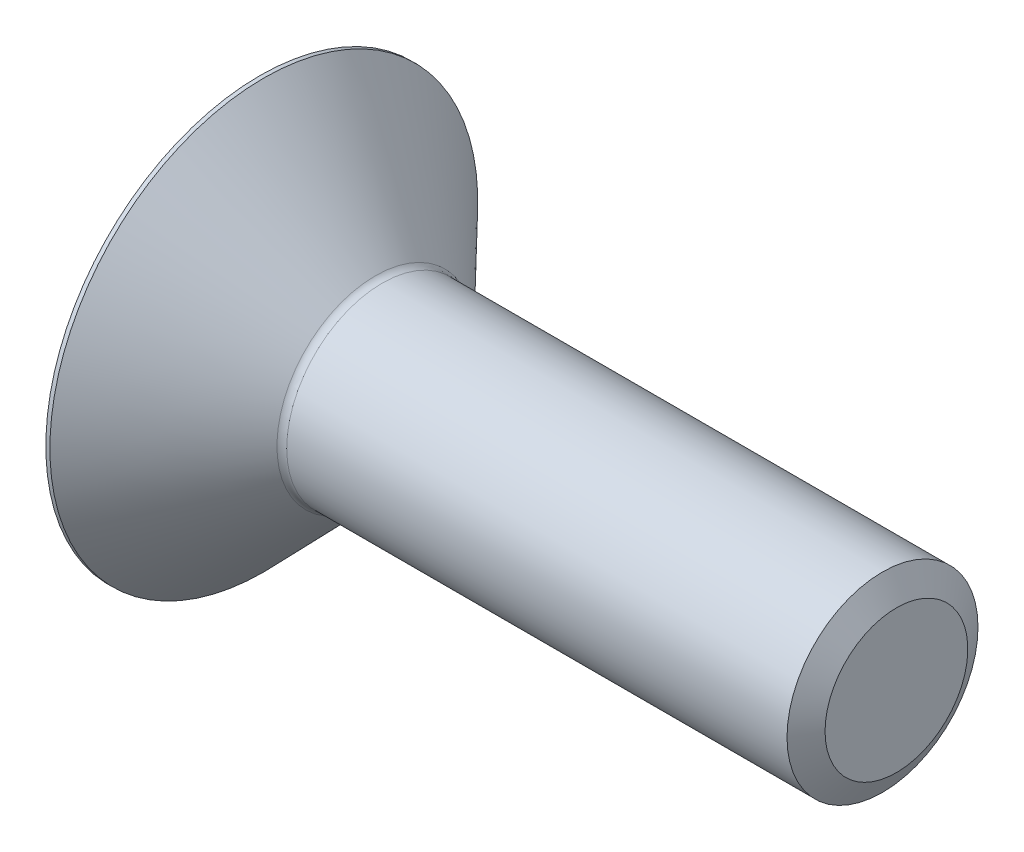
ISO-10303-21;
HEADER;
FILE_DESCRIPTION(('STEP AP214'),'2;1');
FILE_NAME('part.step','',(''),(''),'','','');
FILE_SCHEMA(('AUTOMOTIVE_DESIGN { 1 0 10303 214 1 1 1 1 }'));
ENDSEC;
DATA;
#1=APPLICATION_CONTEXT('core data for automotive mechanical design processes');
#2=APPLICATION_PROTOCOL_DEFINITION('international standard','automotive_design',2000,#1);
#3=PRODUCT_CONTEXT('',#1,'mechanical');
#4=PRODUCT('Part','Part','',(#3));
#5=PRODUCT_RELATED_PRODUCT_CATEGORY('part','',(#4));
#6=PRODUCT_DEFINITION_FORMATION('','',#4);
#7=PRODUCT_DEFINITION_CONTEXT('part definition',#1,'design');
#8=PRODUCT_DEFINITION('design','',#6,#7);
#9=PRODUCT_DEFINITION_SHAPE('','',#8);
#10=(LENGTH_UNIT() NAMED_UNIT(*) SI_UNIT(.MILLI.,.METRE.));
#11=(NAMED_UNIT(*) PLANE_ANGLE_UNIT() SI_UNIT($,.RADIAN.));
#12=(NAMED_UNIT(*) SI_UNIT($,.STERADIAN.) SOLID_ANGLE_UNIT());
#13=UNCERTAINTY_MEASURE_WITH_UNIT(LENGTH_MEASURE(1.E-05),#10,'distance_accuracy_value','');
#14=(GEOMETRIC_REPRESENTATION_CONTEXT(3) GLOBAL_UNCERTAINTY_ASSIGNED_CONTEXT((#13)) GLOBAL_UNIT_ASSIGNED_CONTEXT((#10,
#11,#12)) REPRESENTATION_CONTEXT('',''));
#15=CARTESIAN_POINT('',(0.,0.,0.));
#16=DIRECTION('',(0.,0.,1.));
#17=DIRECTION('',(1.,0.,0.));
#18=AXIS2_PLACEMENT_3D('',#15,#16,#17);
#19=CARTESIAN_POINT('',(0.,0.,0.));
#20=DIRECTION('',(1.,0.,0.));
#21=DIRECTION('',(0.,1.,0.));
#22=AXIS2_PLACEMENT_3D('',#19,#20,#21);
#23=CYLINDRICAL_SURFACE('',#22,6.);
#24=CARTESIAN_POINT('',(-32.3053151102742,0.,0.));
#25=DIRECTION('',(1.,0.,0.));
#26=DIRECTION('',(0.,1.,0.));
#27=AXIS2_PLACEMENT_3D('',#24,#25,#26);
#28=CIRCLE('',#27,6.);
#29=CARTESIAN_POINT('',(-32.3053151102742,5.99999999999999,0.));
#30=VERTEX_POINT('',#29);
#31=EDGE_CURVE('E127',#30,#30,#28,.T.);
#32=ORIENTED_EDGE('',*,*,#31,.T.);
#33=EDGE_LOOP('',(#32));
#34=FACE_BOUND('',#33,.T.);
#35=CARTESIAN_POINT('',(-0.874999999999999,0.,0.));
#36=DIRECTION('',(-1.,0.,0.));
#37=DIRECTION('',(0.,0.,1.));
#38=AXIS2_PLACEMENT_3D('',#35,#36,#37);
#39=CIRCLE('',#38,6.);
#40=CARTESIAN_POINT('',(-0.874999999999999,0.,6.));
#41=VERTEX_POINT('',#40);
#42=EDGE_CURVE('E314',#41,#41,#39,.T.);
#43=ORIENTED_EDGE('',*,*,#42,.T.);
#44=EDGE_LOOP('',(#43));
#45=FACE_BOUND('',#44,.T.);
#46=ADVANCED_FACE('F40',(#34,#45),#23,.T.);
#47=CARTESIAN_POINT('',(-40.,13.44,0.));
#48=DIRECTION('',(-1.,0.,0.));
#49=DIRECTION('',(0.,-1.,0.));
#50=AXIS2_PLACEMENT_3D('',#47,#48,#49);
#51=PLANE('',#50);
#52=CARTESIAN_POINT('',(-40.,0.,0.));
#53=DIRECTION('',(1.,0.,0.));
#54=DIRECTION('',(0.,1.,0.));
#55=AXIS2_PLACEMENT_3D('',#52,#53,#54);
#56=CIRCLE('',#55,13.44);
#57=CARTESIAN_POINT('',(-40.,13.44,0.));
#58=VERTEX_POINT('',#57);
#59=EDGE_CURVE('E216',#58,#58,#56,.T.);
#60=ORIENTED_EDGE('',*,*,#59,.F.);
#61=EDGE_LOOP('',(#60));
#62=FACE_BOUND('',#61,.T.);
#63=CARTESIAN_POINT('',(-40.,0.,0.));
#64=DIRECTION('',(-1.,0.,0.));
#65=DIRECTION('',(0.,-1.,0.));
#66=AXIS2_PLACEMENT_3D('',#63,#64,#65);
#67=CIRCLE('',#66,4.61880215351699);
#68=CARTESIAN_POINT('',(-40.,-2.30940107675853,3.99999999999998));
#69=VERTEX_POINT('',#68);
#70=CARTESIAN_POINT('',(-40.,-4.618802153517,0.));
#71=VERTEX_POINT('',#70);
#72=EDGE_CURVE('E44',#69,#71,#67,.F.);
#73=ORIENTED_EDGE('',*,*,#72,.T.);
#74=CARTESIAN_POINT('',(-40.,-2.30940107675853,-3.99999999999998));
#75=VERTEX_POINT('',#74);
#76=EDGE_CURVE('E11',#71,#75,#67,.F.);
#77=ORIENTED_EDGE('',*,*,#76,.T.);
#78=CARTESIAN_POINT('',(-40.,2.3094010767585,-4.));
#79=VERTEX_POINT('',#78);
#80=EDGE_CURVE('E49',#75,#79,#67,.F.);
#81=ORIENTED_EDGE('',*,*,#80,.T.);
#82=CARTESIAN_POINT('',(-40.,4.618802153517,0.));
#83=VERTEX_POINT('',#82);
#84=EDGE_CURVE('E114',#79,#83,#67,.F.);
#85=ORIENTED_EDGE('',*,*,#84,.T.);
#86=CARTESIAN_POINT('',(-40.,0.,0.));
#87=DIRECTION('',(-1.,0.,0.));
#88=DIRECTION('',(0.,0.,1.));
#89=AXIS2_PLACEMENT_3D('',#86,#87,#88);
#90=CIRCLE('',#89,4.618802153517);
#91=CARTESIAN_POINT('',(-40.,2.30940107675851,3.99999999999998));
#92=VERTEX_POINT('',#91);
#93=EDGE_CURVE('E99',#92,#83,#90,.T.);
#94=ORIENTED_EDGE('',*,*,#93,.F.);
#95=EDGE_CURVE('E108',#92,#69,#67,.F.);
#96=ORIENTED_EDGE('',*,*,#95,.T.);
#97=EDGE_LOOP('',(#73,#77,#81,#85,#94,#96));
#98=FACE_BOUND('',#97,.T.);
#99=ADVANCED_FACE('F115',(#62,#98),#51,.T.);
#100=CARTESIAN_POINT('',(0.,0.,0.));
#101=DIRECTION('',(1.,0.,0.));
#102=DIRECTION('',(0.,1.,0.));
#103=AXIS2_PLACEMENT_3D('',#100,#101,#102);
#104=CYLINDRICAL_SURFACE('',#103,13.44);
#105=ORIENTED_EDGE('',*,*,#59,.T.);
#106=EDGE_LOOP('',(#105));
#107=FACE_BOUND('',#106,.T.);
#108=CARTESIAN_POINT('',(-39.7447244845646,0.,0.));
#109=DIRECTION('',(1.,0.,0.));
#110=DIRECTION('',(0.,1.,0.));
#111=AXIS2_PLACEMENT_3D('',#108,#109,#110);
#112=CIRCLE('',#111,13.44);
#113=CARTESIAN_POINT('',(-39.7447244845646,13.44,0.));
#114=VERTEX_POINT('',#113);
#115=EDGE_CURVE('E218',#114,#114,#112,.T.);
#116=ORIENTED_EDGE('',*,*,#115,.F.);
#117=EDGE_LOOP('',(#116));
#118=FACE_BOUND('',#117,.T.);
#119=ADVANCED_FACE('F206',(#107,#118),#104,.T.);
#120=CARTESIAN_POINT('',(-32.7369189904774,0.,0.));
#121=DIRECTION('',(-1.,0.,0.));
#122=DIRECTION('',(0.,-1.,0.));
#123=AXIS2_PLACEMENT_3D('',#120,#121,#122);
#124=CONICAL_SURFACE('',#123,6.1832049777246,0.802851455917393);
#125=ORIENTED_EDGE('',*,*,#115,.T.);
#126=EDGE_LOOP('',(#125));
#127=FACE_BOUND('',#126,.T.);
#128=CARTESIAN_POINT('',(-32.7369189904774,0.,0.));
#129=DIRECTION('',(1.,0.,0.));
#130=DIRECTION('',(0.,1.,0.));
#131=AXIS2_PLACEMENT_3D('',#128,#129,#130);
#132=CIRCLE('',#131,6.1832049777246);
#133=CARTESIAN_POINT('',(-32.7369189904774,6.1832049777246,0.));
#134=VERTEX_POINT('',#133);
#135=EDGE_CURVE('E222',#134,#134,#132,.T.);
#136=ORIENTED_EDGE('',*,*,#135,.F.);
#137=EDGE_LOOP('',(#136));
#138=FACE_BOUND('',#137,.T.);
#139=ADVANCED_FACE('F202',(#127,#138),#124,.T.);
#140=CARTESIAN_POINT('',(-32.3053151102742,0.,0.));
#141=DIRECTION('',(1.,0.,0.));
#142=DIRECTION('',(0.,1.,0.));
#143=AXIS2_PLACEMENT_3D('',#140,#141,#142);
#144=TOROIDAL_SURFACE('',#143,6.6,0.6);
#145=ORIENTED_EDGE('',*,*,#135,.T.);
#146=EDGE_LOOP('',(#145));
#147=FACE_BOUND('',#146,.T.);
#148=ORIENTED_EDGE('',*,*,#31,.F.);
#149=EDGE_LOOP('',(#148));
#150=FACE_BOUND('',#149,.T.);
#151=ADVANCED_FACE('F198',(#147,#150),#144,.F.);
#152=CARTESIAN_POINT('',(-38.85,0.,0.));
#153=DIRECTION('',(-1.,0.,0.));
#154=DIRECTION('',(0.,0.,1.));
#155=AXIS2_PLACEMENT_3D('',#152,#153,#154);
#156=CONICAL_SURFACE('',#155,0.,1.32677572470749);
#157=CARTESIAN_POINT('',(-40.0000287510781,-2.30928560670467,4.0002));
#158=CARTESIAN_POINT('',(-39.9761262366055,-2.40524228253132,3.83399816214283));
#159=CARTESIAN_POINT('',(-39.9544338125739,-2.50134953729763,3.66753551391162));
#160=CARTESIAN_POINT('',(-39.9163307493937,-2.6938572305768,3.33410240830421));
#161=CARTESIAN_POINT('',(-39.8999219496153,-2.79025775942232,3.16713179446725));
#162=CARTESIAN_POINT('',(-39.8733250365097,-2.98284664605804,2.83355805784107));
#163=CARTESIAN_POINT('',(-39.8631094957814,-3.0790340315532,2.66695661911623));
#164=CARTESIAN_POINT('',(-39.8494121425971,-3.2715148298886,2.3335700969179));
#165=CARTESIAN_POINT('',(-39.8459292143521,-3.36780822251318,2.16678504845895));
#166=CARTESIAN_POINT('',(-39.8459292143521,-3.56039500776234,1.83321495154105));
#167=CARTESIAN_POINT('',(-39.8494121425971,-3.65668840038692,1.66642990308211));
#168=CARTESIAN_POINT('',(-39.8631094957814,-3.84916919872232,1.33304338088377));
#169=CARTESIAN_POINT('',(-39.8733250365097,-3.94535658421748,1.16644194215894));
#170=CARTESIAN_POINT('',(-39.8999219496153,-4.1379454708532,0.832868205532751));
#171=CARTESIAN_POINT('',(-39.9163307493937,-4.23434599969872,0.665897591695795));
#172=CARTESIAN_POINT('',(-39.9544338125739,-4.42685369297789,0.332464486088388));
#173=CARTESIAN_POINT('',(-39.9761262366055,-4.5229609477442,0.166001837857177));
#174=CARTESIAN_POINT('',(-40.0000287510781,-4.61891762357085,-0.000199999999996221));
#175=B_SPLINE_CURVE_WITH_KNOTS('',3,(#157,#158,#159,#160,#161,#162,#163,#164,#165,#166,#167,
#168,#169,#170,#171,#172,#173,#174),.UNSPECIFIED.,.F.,.F.,(4,2,2,2,2,2,2,2,4),(0.,
0.580214361809113,1.16063049385488,1.73845705868434,2.31618785268635,2.89391864668837,
3.47174521151783,4.05216134356359,4.63237570537271),.UNSPECIFIED.);
#176=EDGE_CURVE('E133',#69,#71,#175,.T.);
#177=ORIENTED_EDGE('',*,*,#176,.T.);
#178=ORIENTED_EDGE('',*,*,#72,.F.);
#179=EDGE_LOOP('',(#177,#178));
#180=FACE_BOUND('',#179,.T.);
#181=ADVANCED_FACE('F201',(#180),#156,.F.);
#182=CARTESIAN_POINT('',(-40.6531658994543,-6.0372726914041,4.));
#183=CARTESIAN_POINT('',(-40.6156612032667,-5.85652960970039,4.));
#184=CARTESIAN_POINT('',(-40.5786300277084,-5.67568651509447,4.));
#185=CARTESIAN_POINT('',(-40.5057689980561,-5.31375142320774,4.));
#186=CARTESIAN_POINT('',(-40.4699391909592,-5.13265941647736,4.));
#187=CARTESIAN_POINT('',(-40.3997070353997,-4.77003109173758,4.));
#188=CARTESIAN_POINT('',(-40.3653059804236,-4.58849452217261,4.));
#189=CARTESIAN_POINT('',(-40.2983079457742,-4.22508954319941,4.));
#190=CARTESIAN_POINT('',(-40.265710952185,-4.04322113636201,4.));
#191=CARTESIAN_POINT('',(-40.2029780047449,-3.68043820662348,4.));
#192=CARTESIAN_POINT('',(-40.1728256671563,-3.49952654647656,4.));
#193=CARTESIAN_POINT('',(-40.1152384734973,-3.13727227626469,4.));
#194=CARTESIAN_POINT('',(-40.0878036723086,-2.9559296575721,4.));
#195=CARTESIAN_POINT('',(-40.010503374074,-2.4112210764591,4.));
#196=CARTESIAN_POINT('',(-39.9656282593921,-2.04709796683747,4.));
#197=CARTESIAN_POINT('',(-39.9126176108585,-1.4977474310426,4.));
#198=CARTESIAN_POINT('',(-39.8972925676252,-1.31321089029442,4.));
#199=CARTESIAN_POINT('',(-39.8723160639415,-0.943748539171525,4.));
#200=CARTESIAN_POINT('',(-39.8626644946285,-0.758822736334318,4.));
#201=CARTESIAN_POINT('',(-39.8495850647974,-0.388815660391335,4.));
#202=CARTESIAN_POINT('',(-39.8461549118252,-0.203734469703243,4.));
#203=CARTESIAN_POINT('',(-39.8457251655717,0.166435849319334,4.));
#204=CARTESIAN_POINT('',(-39.8487255774784,0.351524977660103,4.));
#205=CARTESIAN_POINT('',(-39.8609910803285,0.722133856860165,4.));
#206=CARTESIAN_POINT('',(-39.8702778569606,0.907652875611503,4.));
#207=CARTESIAN_POINT('',(-39.89460155466,1.2783152660396,4.));
#208=CARTESIAN_POINT('',(-39.9096387394688,1.46345862009495,4.));
#209=CARTESIAN_POINT('',(-39.944727663009,1.83336172919972,4.));
#210=CARTESIAN_POINT('',(-39.9647820633665,2.01812122799055,4.));
#211=CARTESIAN_POINT('',(-40.0090988890259,2.38712893300897,4.));
#212=CARTESIAN_POINT('',(-40.033361317837,2.57137713881005,4.));
#213=CARTESIAN_POINT('',(-40.0857750347695,2.94247442134078,4.));
#214=CARTESIAN_POINT('',(-40.1139848322788,3.12931516200101,4.));
#215=CARTESIAN_POINT('',(-40.1732933802045,3.50253875334881,4.));
#216=CARTESIAN_POINT('',(-40.2043922035013,3.68892159236323,4.));
#217=CARTESIAN_POINT('',(-40.301148333619,4.24750541552292,4.));
#218=CARTESIAN_POINT('',(-40.3702600615826,4.61910627019015,4.));
#219=CARTESIAN_POINT('',(-40.5144472924255,5.36122850669968,4.));
#220=CARTESIAN_POINT('',(-40.5895243500106,5.73174958086943,4.));
#221=CARTESIAN_POINT('',(-40.7436615712989,6.47196710563243,4.));
#222=CARTESIAN_POINT('',(-40.8227218202131,6.84166353840756,4.));
#223=CARTESIAN_POINT('',(-40.9827550966561,7.57666327173795,4.));
#224=CARTESIAN_POINT('',(-41.0637001411816,7.94197269675811,4.));
#225=CARTESIAN_POINT('',(-41.2275070330427,8.67216809253757,4.));
#226=CARTESIAN_POINT('',(-41.3103689176876,9.03705405490925,4.));
#227=CARTESIAN_POINT('',(-41.4773877070812,9.76605551390585,4.));
#228=CARTESIAN_POINT('',(-41.5615428900756,10.1301714058672,4.));
#229=CARTESIAN_POINT('',(-41.7309197185527,10.8581431271894,4.));
#230=CARTESIAN_POINT('',(-41.8161413303297,11.2219989643871,4.));
#231=CARTESIAN_POINT('',(-41.9017347799837,11.5857663223311,4.));
#232=B_SPLINE_CURVE_WITH_KNOTS('',3,(#182,#183,#184,#185,#186,#187,#188,#189,#190,#191,#192,
#193,#194,#195,#196,#197,#198,#199,#200,#201,#202,#203,#204,#205,#206,#207,#208,#209,#210,#211,
#212,#213,#214,#215,#216,#217,#218,#219,#220,#221,#222,#223,#224,#225,#226,#227,#228,#229,#230,
#231),.UNSPECIFIED.,.F.,.F.,(4,2,2,2,2,2,2,2,2,2,2,2,2,2,2,2,2,2,2,2,2,2,2,2,4),(0.,
0.553781623134435,1.10758488486369,1.66187905101063,2.21616894097256,2.76636911213748,
3.31658039249942,4.41677010828794,4.97221458532111,5.52764840413099,6.08287751626023,
6.63810707633677,7.19526180507613,7.75244209069512,8.30991858881531,8.86739555183081,
9.43424254988271,10.0011038514753,11.1349338819816,12.269060390793,13.4032111719167,
14.5257142074695,15.6482391096738,16.7693806718472,17.8904868879894),.UNSPECIFIED.);
#233=EDGE_CURVE('E104',#92,#69,#232,.F.);
#234=ORIENTED_EDGE('',*,*,#233,.T.);
#235=ORIENTED_EDGE('',*,*,#95,.F.);
#236=EDGE_LOOP('',(#234,#235));
#237=FACE_BOUND('',#236,.T.);
#238=ADVANCED_FACE('F109',(#237),#156,.F.);
#239=CARTESIAN_POINT('',(-40.0000287510781,4.61891762357084,-0.000200000000001269));
#240=CARTESIAN_POINT('',(-39.9761262366055,4.52296094774419,0.166001837857172));
#241=CARTESIAN_POINT('',(-39.9544338125739,4.42685369297788,0.332464486088382));
#242=CARTESIAN_POINT('',(-39.9163307493937,4.23434599969871,0.665897591695789));
#243=CARTESIAN_POINT('',(-39.8999219496153,4.13794547085319,0.832868205532746));
#244=CARTESIAN_POINT('',(-39.8733250365097,3.94535658421747,1.16644194215893));
#245=CARTESIAN_POINT('',(-39.8631094957813,3.84916919872231,1.33304338088377));
#246=CARTESIAN_POINT('',(-39.8494121425971,3.65668840038691,1.6664299030821));
#247=CARTESIAN_POINT('',(-39.8459292143521,3.56039500776233,1.83321495154105));
#248=CARTESIAN_POINT('',(-39.8459292143521,3.36780822251317,2.16678504845895));
#249=CARTESIAN_POINT('',(-39.8494121425971,3.27151482988859,2.3335700969179));
#250=CARTESIAN_POINT('',(-39.8631094957813,3.07903403155319,2.66695661911623));
#251=CARTESIAN_POINT('',(-39.8733250365097,2.98284664605803,2.83355805784107));
#252=CARTESIAN_POINT('',(-39.8999219496153,2.79025775942231,3.16713179446725));
#253=CARTESIAN_POINT('',(-39.9163307493937,2.69385723057679,3.33410240830421));
#254=CARTESIAN_POINT('',(-39.9544338125739,2.50134953729762,3.66753551391162));
#255=CARTESIAN_POINT('',(-39.9761262366055,2.40524228253131,3.83399816214283));
#256=CARTESIAN_POINT('',(-40.0000287510781,2.30928560670466,4.0002));
#257=B_SPLINE_CURVE_WITH_KNOTS('',3,(#239,#240,#241,#242,#243,#244,#245,#246,#247,#248,#249,
#250,#251,#252,#253,#254,#255,#256),.UNSPECIFIED.,.F.,.F.,(4,2,2,2,2,2,2,2,4),(0.,
0.580214361809113,1.16063049385488,1.73845705868434,2.31618785268636,2.89391864668837,
3.47174521151783,4.0521613435636,4.63237570537271),.UNSPECIFIED.);
#258=EDGE_CURVE('E95',#83,#92,#257,.T.);
#259=ORIENTED_EDGE('',*,*,#258,.T.);
#260=ORIENTED_EDGE('',*,*,#93,.T.);
#261=EDGE_LOOP('',(#259,#260));
#262=FACE_BOUND('',#261,.T.);
#263=ADVANCED_FACE('F97',(#262),#156,.F.);
#264=CARTESIAN_POINT('',(-40.0000287510781,2.30928560670466,-4.0002));
#265=CARTESIAN_POINT('',(-39.9761262366055,2.40524228253131,-3.83399816214283));
#266=CARTESIAN_POINT('',(-39.9544338125739,2.50134953729762,-3.66753551391162));
#267=CARTESIAN_POINT('',(-39.9163307493937,2.69385723057679,-3.33410240830421));
#268=CARTESIAN_POINT('',(-39.8999219496153,2.79025775942231,-3.16713179446725));
#269=CARTESIAN_POINT('',(-39.8733250365097,2.98284664605803,-2.83355805784107));
#270=CARTESIAN_POINT('',(-39.8631094957813,3.07903403155319,-2.66695661911623));
#271=CARTESIAN_POINT('',(-39.8494121425971,3.27151482988859,-2.3335700969179));
#272=CARTESIAN_POINT('',(-39.8459292143521,3.36780822251317,-2.16678504845895));
#273=CARTESIAN_POINT('',(-39.8459292143521,3.56039500776233,-1.83321495154105));
#274=CARTESIAN_POINT('',(-39.8494121425971,3.6566884003869,-1.66642990308211));
#275=CARTESIAN_POINT('',(-39.8631094957813,3.8491691987223,-1.33304338088377));
#276=CARTESIAN_POINT('',(-39.8733250365097,3.94535658421747,-1.16644194215894));
#277=CARTESIAN_POINT('',(-39.8999219496153,4.13794547085319,-0.83286820553275));
#278=CARTESIAN_POINT('',(-39.9163307493937,4.23434599969871,-0.665897591695794));
#279=CARTESIAN_POINT('',(-39.9544338125739,4.42685369297788,-0.332464486088386));
#280=CARTESIAN_POINT('',(-39.9761262366055,4.52296094774419,-0.166001837857176));
#281=CARTESIAN_POINT('',(-40.0000287510781,4.61891762357084,0.000199999999997369));
#282=B_SPLINE_CURVE_WITH_KNOTS('',3,(#264,#265,#266,#267,#268,#269,#270,#271,#272,#273,#274,
#275,#276,#277,#278,#279,#280,#281),.UNSPECIFIED.,.F.,.F.,(4,2,2,2,2,2,2,2,4),(0.,
0.580214361809114,1.16063049385488,1.73845705868434,2.31618785268635,2.89391864668837,
3.47174521151783,4.0521613435636,4.63237570537271),.UNSPECIFIED.);
#283=EDGE_CURVE('E117',#79,#83,#282,.T.);
#284=ORIENTED_EDGE('',*,*,#283,.T.);
#285=ORIENTED_EDGE('',*,*,#84,.F.);
#286=EDGE_LOOP('',(#284,#285));
#287=FACE_BOUND('',#286,.T.);
#288=ADVANCED_FACE('F297',(#287),#156,.F.);
#289=CARTESIAN_POINT('',(-40.6531658994543,-6.0372726914041,-4.));
#290=CARTESIAN_POINT('',(-40.6156612032667,-5.85652960970039,-4.));
#291=CARTESIAN_POINT('',(-40.5786300277084,-5.67568651509447,-4.));
#292=CARTESIAN_POINT('',(-40.5057689980561,-5.31375142320774,-4.));
#293=CARTESIAN_POINT('',(-40.4699391909592,-5.13265941647736,-4.));
#294=CARTESIAN_POINT('',(-40.3997070353997,-4.77003109173758,-4.));
#295=CARTESIAN_POINT('',(-40.3653059804236,-4.58849452217261,-4.));
#296=CARTESIAN_POINT('',(-40.2983079457742,-4.22508954319941,-4.));
#297=CARTESIAN_POINT('',(-40.265710952185,-4.04322113636201,-4.));
#298=CARTESIAN_POINT('',(-40.2029780047449,-3.68043820662348,-4.));
#299=CARTESIAN_POINT('',(-40.1728256671563,-3.49952654647656,-4.));
#300=CARTESIAN_POINT('',(-40.1152384734973,-3.13727227626469,-4.));
#301=CARTESIAN_POINT('',(-40.0878036723086,-2.9559296575721,-4.));
#302=CARTESIAN_POINT('',(-40.010503374074,-2.4112210764591,-4.));
#303=CARTESIAN_POINT('',(-39.9656282593921,-2.04709796683748,-4.));
#304=CARTESIAN_POINT('',(-39.9126176108585,-1.4977474310426,-4.));
#305=CARTESIAN_POINT('',(-39.8972925676252,-1.31321089029442,-4.));
#306=CARTESIAN_POINT('',(-39.8723160639415,-0.943748539171524,-4.));
#307=CARTESIAN_POINT('',(-39.8626644946285,-0.758822736334318,-4.));
#308=CARTESIAN_POINT('',(-39.8495850647974,-0.388815660391334,-4.));
#309=CARTESIAN_POINT('',(-39.8461549118252,-0.203734469703243,-4.));
#310=CARTESIAN_POINT('',(-39.8457251655717,0.166435849319334,-4.));
#311=CARTESIAN_POINT('',(-39.8487255774784,0.351524977660103,-4.));
#312=CARTESIAN_POINT('',(-39.8609910803285,0.722133856860166,-4.));
#313=CARTESIAN_POINT('',(-39.8702778569606,0.907652875611503,-4.));
#314=CARTESIAN_POINT('',(-39.89460155466,1.2783152660396,-4.));
#315=CARTESIAN_POINT('',(-39.9096387394688,1.46345862009495,-4.));
#316=CARTESIAN_POINT('',(-39.944727663009,1.83336172919972,-4.));
#317=CARTESIAN_POINT('',(-39.9647820633665,2.01812122799055,-4.));
#318=CARTESIAN_POINT('',(-40.0090988890259,2.38712893300897,-4.));
#319=CARTESIAN_POINT('',(-40.033361317837,2.57137713881005,-4.));
#320=CARTESIAN_POINT('',(-40.0857750347695,2.94247442134078,-4.));
#321=CARTESIAN_POINT('',(-40.1139848322788,3.12931516200101,-4.));
#322=CARTESIAN_POINT('',(-40.1732933802045,3.50253875334881,-4.));
#323=CARTESIAN_POINT('',(-40.2043922035013,3.68892159236322,-4.));
#324=CARTESIAN_POINT('',(-40.301148333619,4.24750541552292,-4.));
#325=CARTESIAN_POINT('',(-40.3702600615826,4.61910627019015,-4.));
#326=CARTESIAN_POINT('',(-40.5144472924255,5.36122850669968,-4.));
#327=CARTESIAN_POINT('',(-40.5895243500106,5.73174958086943,-4.));
#328=CARTESIAN_POINT('',(-40.7436615712989,6.47196710563242,-4.));
#329=CARTESIAN_POINT('',(-40.8227218202131,6.84166353840756,-4.));
#330=CARTESIAN_POINT('',(-40.9827550966561,7.57666327173794,-4.));
#331=CARTESIAN_POINT('',(-41.0637001411816,7.9419726967581,-4.));
#332=CARTESIAN_POINT('',(-41.2275070330427,8.67216809253757,-4.));
#333=CARTESIAN_POINT('',(-41.3103689176876,9.03705405490925,-4.));
#334=CARTESIAN_POINT('',(-41.4773877070813,9.76605551390585,-4.));
#335=CARTESIAN_POINT('',(-41.5615428900756,10.1301714058672,-4.));
#336=CARTESIAN_POINT('',(-41.7309197185527,10.8581431271894,-4.));
#337=CARTESIAN_POINT('',(-41.8161413303297,11.2219989643871,-4.));
#338=CARTESIAN_POINT('',(-41.9017347799837,11.5857663223311,-4.));
#339=B_SPLINE_CURVE_WITH_KNOTS('',3,(#289,#290,#291,#292,#293,#294,#295,#296,#297,#298,#299,
#300,#301,#302,#303,#304,#305,#306,#307,#308,#309,#310,#311,#312,#313,#314,#315,#316,#317,#318,
#319,#320,#321,#322,#323,#324,#325,#326,#327,#328,#329,#330,#331,#332,#333,#334,#335,#336,#337,
#338),.UNSPECIFIED.,.F.,.F.,(4,2,2,2,2,2,2,2,2,2,2,2,2,2,2,2,2,2,2,2,2,2,2,2,4),(0.,
0.553781623134435,1.10758488486369,1.66187905101063,2.21616894097256,2.76636911213748,
3.31658039249942,4.41677010828794,4.97221458532111,5.52764840413099,6.08287751626023,
6.63810707633677,7.19526180507613,7.75244209069512,8.30991858881531,8.86739555183081,
9.4342425498827,10.0011038514753,11.1349338819816,12.269060390793,13.4032111719167,
14.5257142074695,15.6482391096738,16.7693806718472,17.8904868879894),.UNSPECIFIED.);
#340=EDGE_CURVE('E252',#75,#79,#339,.T.);
#341=ORIENTED_EDGE('',*,*,#340,.T.);
#342=ORIENTED_EDGE('',*,*,#80,.F.);
#343=EDGE_LOOP('',(#341,#342));
#344=FACE_BOUND('',#343,.T.);
#345=ADVANCED_FACE('F284',(#344),#156,.F.);
#346=CARTESIAN_POINT('',(-40.0000287510781,-4.61891762357085,0.000200000000002437));
#347=CARTESIAN_POINT('',(-39.9761262366055,-4.5229609477442,-0.166001837857172));
#348=CARTESIAN_POINT('',(-39.9544338125739,-4.42685369297789,-0.332464486088382));
#349=CARTESIAN_POINT('',(-39.9163307493937,-4.23434599969872,-0.665897591695789));
#350=CARTESIAN_POINT('',(-39.8999219496153,-4.1379454708532,-0.832868205532746));
#351=CARTESIAN_POINT('',(-39.8733250365097,-3.94535658421748,-1.16644194215893));
#352=CARTESIAN_POINT('',(-39.8631094957814,-3.84916919872232,-1.33304338088377));
#353=CARTESIAN_POINT('',(-39.8494121425971,-3.65668840038692,-1.6664299030821));
#354=CARTESIAN_POINT('',(-39.8459292143521,-3.56039500776234,-1.83321495154105));
#355=CARTESIAN_POINT('',(-39.8459292143521,-3.36780822251318,-2.16678504845895));
#356=CARTESIAN_POINT('',(-39.8494121425971,-3.2715148298886,-2.33357009691789));
#357=CARTESIAN_POINT('',(-39.8631094957814,-3.0790340315532,-2.66695661911623));
#358=CARTESIAN_POINT('',(-39.8733250365097,-2.98284664605804,-2.83355805784106));
#359=CARTESIAN_POINT('',(-39.8999219496153,-2.79025775942232,-3.16713179446725));
#360=CARTESIAN_POINT('',(-39.9163307493937,-2.6938572305768,-3.33410240830421));
#361=CARTESIAN_POINT('',(-39.9544338125739,-2.50134953729763,-3.66753551391162));
#362=CARTESIAN_POINT('',(-39.9761262366055,-2.40524228253132,-3.83399816214283));
#363=CARTESIAN_POINT('',(-40.0000287510781,-2.30928560670467,-4.0002));
#364=B_SPLINE_CURVE_WITH_KNOTS('',3,(#346,#347,#348,#349,#350,#351,#352,#353,#354,#355,#356,
#357,#358,#359,#360,#361,#362,#363),.UNSPECIFIED.,.F.,.F.,(4,2,2,2,2,2,2,2,4),(0.,
0.580214361809114,1.16063049385488,1.73845705868434,2.31618785268636,2.89391864668837,
3.47174521151783,4.0521613435636,4.63237570537271),.UNSPECIFIED.);
#365=EDGE_CURVE('E135',#71,#75,#364,.T.);
#366=ORIENTED_EDGE('',*,*,#365,.T.);
#367=ORIENTED_EDGE('',*,*,#76,.F.);
#368=EDGE_LOOP('',(#366,#367));
#369=FACE_BOUND('',#368,.T.);
#370=ADVANCED_FACE('F287',(#369),#156,.F.);
#371=CARTESIAN_POINT('',(-35.7,0.,0.));
#372=DIRECTION('',(-1.,0.,0.));
#373=DIRECTION('',(0.,0.,1.));
#374=AXIS2_PLACEMENT_3D('',#371,#372,#373);
#375=CONICAL_SURFACE('',#374,4.618802153517,1.0471975511966);
#376=CARTESIAN_POINT('',(-33.0333333333334,0.,0.));
#377=VERTEX_POINT('',#376);
#378=VERTEX_LOOP('',#377);
#379=FACE_BOUND('',#378,.T.);
#380=CARTESIAN_POINT('',(-37.1873411549579,-5.98058048573496,4.));
#381=CARTESIAN_POINT('',(-37.1044700245007,-5.80784670759072,4.));
#382=CARTESIAN_POINT('',(-37.0224596598605,-5.63469212636439,4.));
#383=CARTESIAN_POINT('',(-36.8606487629479,-5.28731708665706,4.));
#384=CARTESIAN_POINT('',(-36.7808486282938,-5.11309644318737,4.));
#385=CARTESIAN_POINT('',(-36.6235006812962,-4.76236606559359,4.));
#386=CARTESIAN_POINT('',(-36.5459694680115,-4.58584885652401,4.));
#387=CARTESIAN_POINT('',(-36.3943837325628,-4.23133321597181,4.));
#388=CARTESIAN_POINT('',(-36.3203290297378,-4.05333486202584,4.));
#389=CARTESIAN_POINT('',(-36.1747363355541,-3.69088499705829,4.));
#390=CARTESIAN_POINT('',(-36.1033147689959,-3.50638644297961,4.));
#391=CARTESIAN_POINT('',(-35.9664096913817,-3.13515770172186,4.));
#392=CARTESIAN_POINT('',(-35.9009268685287,-2.94842725873399,4.));
#393=CARTESIAN_POINT('',(-35.7777691499943,-2.57286067808247,4.));
#394=CARTESIAN_POINT('',(-35.7200765274196,-2.38403041681361,4.));
#395=CARTESIAN_POINT('',(-35.6144804578014,-2.00368028952638,4.));
#396=CARTESIAN_POINT('',(-35.5665737206469,-1.81216135068872,4.));
#397=CARTESIAN_POINT('',(-35.4830948045453,-1.42680806606993,4.));
#398=CARTESIAN_POINT('',(-35.4474978254975,-1.23297919919048,4.));
#399=CARTESIAN_POINT('',(-35.3909722954712,-0.843152935945129,4.));
#400=CARTESIAN_POINT('',(-35.3700427532411,-0.647155687031914,4.));
#401=CARTESIAN_POINT('',(-35.3447939487143,-0.256426237052258,4.));
#402=CARTESIAN_POINT('',(-35.3402786739049,-0.0617070156788274,4.));
#403=CARTESIAN_POINT('',(-35.3477372597061,0.327427057909878,4.));
#404=CARTESIAN_POINT('',(-35.3597121413234,0.5218418905324,4.));
#405=CARTESIAN_POINT('',(-35.3939189494519,0.858492133936372,4.));
#406=CARTESIAN_POINT('',(-35.4126570574185,1.00109968678613,4.));
#407=CARTESIAN_POINT('',(-35.4577165840893,1.28512035864658,4.));
#408=CARTESIAN_POINT('',(-35.4840392206089,1.42653328208445,4.));
#409=CARTESIAN_POINT('',(-35.5729836016411,1.84887060956338,4.));
#410=CARTESIAN_POINT('',(-35.6455612783532,2.12771363401474,4.));
#411=CARTESIAN_POINT('',(-35.769545420484,2.54463403697463,4.));
#412=CARTESIAN_POINT('',(-35.8139652275472,2.68490955346113,4.));
#413=CARTESIAN_POINT('',(-35.9069408039392,2.96409641081465,4.));
#414=CARTESIAN_POINT('',(-35.9554966029578,3.10300774188102,4.));
#415=CARTESIAN_POINT('',(-36.0560050379674,3.37952175346406,4.));
#416=CARTESIAN_POINT('',(-36.1079563008526,3.51712493751581,4.));
#417=CARTESIAN_POINT('',(-36.2146925075442,3.79122218575724,4.));
#418=CARTESIAN_POINT('',(-36.269477404612,3.92771626819771,4.));
#419=CARTESIAN_POINT('',(-36.4128337192166,4.27613437444124,4.));
#420=CARTESIAN_POINT('',(-36.5030975139485,4.48736117276817,4.));
#421=CARTESIAN_POINT('',(-36.6879674514664,4.90791175320295,4.));
#422=CARTESIAN_POINT('',(-36.7825739184483,5.11723539183101,4.));
#423=CARTESIAN_POINT('',(-36.9751493067303,5.53438668938211,4.));
#424=CARTESIAN_POINT('',(-37.0731190265404,5.7422139786709,4.));
#425=CARTESIAN_POINT('',(-37.2716749585423,6.15661687556671,4.));
#426=CARTESIAN_POINT('',(-37.3722612289291,6.36319245520808,4.));
#427=CARTESIAN_POINT('',(-37.6773373176488,6.98188352703504,4.));
#428=CARTESIAN_POINT('',(-37.884915461303,7.39247472048975,4.));
#429=CARTESIAN_POINT('',(-38.3053769294737,8.21083882153887,4.));
#430=CARTESIAN_POINT('',(-38.5182594881731,8.61861212522776,4.));
#431=CARTESIAN_POINT('',(-38.9274428142801,9.3938171979582,4.));
#432=CARTESIAN_POINT('',(-39.1234122944532,9.76142411453316,4.));
#433=CARTESIAN_POINT('',(-39.5175834568933,10.4954575750993,4.));
#434=CARTESIAN_POINT('',(-39.7157852338269,10.8618840681776,4.));
#435=CARTESIAN_POINT('',(-40.1133558727367,11.5928951105863,4.));
#436=CARTESIAN_POINT('',(-40.3127204839116,11.9574819743433,4.));
#437=CARTESIAN_POINT('',(-40.7127462061154,12.685916623618,4.));
#438=CARTESIAN_POINT('',(-40.9134072416263,13.0497644505911,4.));
#439=CARTESIAN_POINT('',(-41.1145438581009,13.4133474806568,4.));
#440=B_SPLINE_CURVE_WITH_KNOTS('',3,(#380,#381,#382,#383,#384,#385,#386,#387,#388,#389,#390,
#391,#392,#393,#394,#395,#396,#397,#398,#399,#400,#401,#402,#403,#404,#405,#406,#407,#408,#409,
#410,#411,#412,#413,#414,#415,#416,#417,#418,#419,#420,#421,#422,#423,#424,#425,#426,#427,#428,
#429,#430,#431,#432,#433,#434,#435,#436,#437,#438,#439),.UNSPECIFIED.,.F.,.F.,(4,2,2,2,2,2,2,2,
2,2,2,2,2,2,2,2,2,2,2,2,2,2,2,2,2,2,2,2,2,4),(0.,0.574761370307675,1.14962547673856,
1.72797672978675,2.30629789476933,2.89973967127566,3.4932501303152,4.0853864165937,
4.67732329197052,5.26806056548362,5.85875791206603,6.44237778127161,7.0260337875884,
7.45732061354804,7.88867672801484,8.75192987200842,9.19332039051546,9.63471407776294,
10.0759303593435,10.5171393657402,11.2061833998006,11.895278957385,12.5845392685294,
13.2738149227362,14.6539847216121,16.0339564020039,17.2836859261785,18.5334686495723,
19.7800725072577,21.0266043924249),.UNSPECIFIED.);
#441=CARTESIAN_POINT('',(-35.7,-2.30940107675851,4.));
#442=VERTEX_POINT('',#441);
#443=CARTESIAN_POINT('',(-35.7,2.3094010767585,4.));
#444=VERTEX_POINT('',#443);
#445=EDGE_CURVE('E167',#442,#444,#440,.T.);
#446=ORIENTED_EDGE('',*,*,#445,.T.);
#447=CARTESIAN_POINT('',(-35.7000666691666,2.30928560670466,4.0002));
#448=CARTESIAN_POINT('',(-35.6414522837401,2.4107717464617,3.82442084967677));
#449=CARTESIAN_POINT('',(-35.5881447315541,2.51313390883499,3.64712438367362));
#450=CARTESIAN_POINT('',(-35.4950960808383,2.71963072479811,3.28946140682429));
#451=CARTESIAN_POINT('',(-35.4553878991215,2.82376904741904,3.10908854102985));
#452=CARTESIAN_POINT('',(-35.3935766253721,3.03075510011795,2.75057818129721));
#453=CARTESIAN_POINT('',(-35.3710621416147,3.13357098372491,2.57249584706486));
#454=CARTESIAN_POINT('',(-35.3441850332384,3.33968651028528,2.21549328283349));
#455=CARTESIAN_POINT('',(-35.3398001515188,3.44298540411434,2.0365743503559));
#456=CARTESIAN_POINT('',(-35.3489244830318,3.63600352522932,1.70225715780327));
#457=CARTESIAN_POINT('',(-35.3601933640798,3.72575165335064,1.54680884001293));
#458=CARTESIAN_POINT('',(-35.39590840089,3.90466320392054,1.23692494436494));
#459=CARTESIAN_POINT('',(-35.4203667558034,3.99382600759478,1.08249043825587));
#460=CARTESIAN_POINT('',(-35.4815104750111,4.17310641015196,0.771967672225422));
#461=CARTESIAN_POINT('',(-35.5184550137467,4.2632013193813,0.615918711936898));
#462=CARTESIAN_POINT('',(-35.6023044826399,4.4420474282755,0.306148164596161));
#463=CARTESIAN_POINT('',(-35.6491897123046,4.53080091904966,0.152422609226221));
#464=CARTESIAN_POINT('',(-35.7000666691666,4.61891762357084,-0.000200000000000855));
#465=B_SPLINE_CURVE_WITH_KNOTS('',3,(#447,#448,#449,#450,#451,#452,#453,#454,#455,#456,#457,
#458,#459,#460,#461,#462,#463,#464),.UNSPECIFIED.,.F.,.F.,(4,2,2,2,2,2,2,2,4),(0.,
0.634047835695965,1.26961969224543,1.88946157213122,2.50854226669297,3.04757825393386,
3.58711366126903,4.13861653143764,4.68903648037743),.UNSPECIFIED.);
#466=CARTESIAN_POINT('',(-35.7,4.618802153517,0.));
#467=VERTEX_POINT('',#466);
#468=EDGE_CURVE('E124',#444,#467,#465,.T.);
#469=ORIENTED_EDGE('',*,*,#468,.T.);
#470=CARTESIAN_POINT('',(-35.7000666691666,4.61891762357084,0.000199999999998348));
#471=CARTESIAN_POINT('',(-35.6414522837401,4.5174314838138,-0.175579150323228));
#472=CARTESIAN_POINT('',(-35.5881447315541,4.41506932144051,-0.352875616326381));
#473=CARTESIAN_POINT('',(-35.4950960808382,4.20857250547739,-0.710538593175706));
#474=CARTESIAN_POINT('',(-35.4553878991215,4.10443418285646,-0.890911458970151));
#475=CARTESIAN_POINT('',(-35.3935766253721,3.89744813015755,-1.24942181870279));
#476=CARTESIAN_POINT('',(-35.3710621416147,3.79463224655059,-1.42750415293514));
#477=CARTESIAN_POINT('',(-35.3441850332384,3.58851671999022,-1.78450671716651));
#478=CARTESIAN_POINT('',(-35.3398001515188,3.48521782616116,-1.9634256496441));
#479=CARTESIAN_POINT('',(-35.3489244830318,3.29219970504618,-2.29774284219673));
#480=CARTESIAN_POINT('',(-35.3601933640798,3.20245157692486,-2.45319115998706));
#481=CARTESIAN_POINT('',(-35.39590840089,3.02354002635496,-2.76307505563505));
#482=CARTESIAN_POINT('',(-35.4203667558034,2.93437722268072,-2.91750956174413));
#483=CARTESIAN_POINT('',(-35.4815104750111,2.75509682012353,-3.22803232777458));
#484=CARTESIAN_POINT('',(-35.5184550137467,2.66500191089419,-3.3840812880631));
#485=CARTESIAN_POINT('',(-35.6023044826399,2.486155802,-3.69385183540384));
#486=CARTESIAN_POINT('',(-35.6491897123046,2.39740231122584,-3.84757739077378));
#487=CARTESIAN_POINT('',(-35.7000666691666,2.30928560670466,-4.0002));
#488=B_SPLINE_CURVE_WITH_KNOTS('',3,(#470,#471,#472,#473,#474,#475,#476,#477,#478,#479,#480,
#481,#482,#483,#484,#485,#486,#487),.UNSPECIFIED.,.F.,.F.,(4,2,2,2,2,2,2,2,4),(0.,
0.634047835695964,1.26961969224543,1.88946157213122,2.50854226669297,3.04757825393385,
3.58711366126903,4.13861653143763,4.68903648037743),.UNSPECIFIED.);
#489=CARTESIAN_POINT('',(-35.7,2.30940107675851,-3.99999999999999));
#490=VERTEX_POINT('',#489);
#491=EDGE_CURVE('E217',#467,#490,#488,.T.);
#492=ORIENTED_EDGE('',*,*,#491,.T.);
#493=CARTESIAN_POINT('',(-37.1873411549579,-5.98058048573496,-4.));
#494=CARTESIAN_POINT('',(-37.1044700245007,-5.80784670759072,-4.));
#495=CARTESIAN_POINT('',(-37.0224596598605,-5.63469212636439,-4.));
#496=CARTESIAN_POINT('',(-36.8606487629479,-5.28731708665706,-4.));
#497=CARTESIAN_POINT('',(-36.7808486282938,-5.11309644318737,-4.));
#498=CARTESIAN_POINT('',(-36.6235006812962,-4.76236606559359,-4.));
#499=CARTESIAN_POINT('',(-36.5459694680115,-4.58584885652401,-4.));
#500=CARTESIAN_POINT('',(-36.3943837325628,-4.23133321597181,-4.));
#501=CARTESIAN_POINT('',(-36.3203290297378,-4.05333486202584,-4.));
#502=CARTESIAN_POINT('',(-36.1747363355541,-3.69088499705829,-4.));
#503=CARTESIAN_POINT('',(-36.1033147689959,-3.50638644297961,-4.));
#504=CARTESIAN_POINT('',(-35.9664096913817,-3.13515770172186,-4.));
#505=CARTESIAN_POINT('',(-35.9009268685287,-2.94842725873399,-4.));
#506=CARTESIAN_POINT('',(-35.7777691499943,-2.57286067808247,-4.));
#507=CARTESIAN_POINT('',(-35.7200765274196,-2.38403041681361,-4.));
#508=CARTESIAN_POINT('',(-35.6144804578014,-2.00368028952638,-4.));
#509=CARTESIAN_POINT('',(-35.5665737206469,-1.81216135068872,-4.));
#510=CARTESIAN_POINT('',(-35.4830948045453,-1.42680806606993,-4.));
#511=CARTESIAN_POINT('',(-35.4474978254975,-1.23297919919048,-4.));
#512=CARTESIAN_POINT('',(-35.3909722954712,-0.84315293594513,-4.));
#513=CARTESIAN_POINT('',(-35.3700427532411,-0.647155687031915,-4.));
#514=CARTESIAN_POINT('',(-35.3447939487143,-0.256426237052259,-4.));
#515=CARTESIAN_POINT('',(-35.3402786739049,-0.0617070156788282,-4.));
#516=CARTESIAN_POINT('',(-35.3477372597061,0.327427057909878,-4.));
#517=CARTESIAN_POINT('',(-35.3597121413234,0.521841890532399,-4.));
#518=CARTESIAN_POINT('',(-35.3939189494519,0.858492133936371,-4.));
#519=CARTESIAN_POINT('',(-35.4126570574185,1.00109968678613,-4.));
#520=CARTESIAN_POINT('',(-35.4577165840893,1.28512035864658,-4.));
#521=CARTESIAN_POINT('',(-35.4840392206089,1.42653328208445,-4.));
#522=CARTESIAN_POINT('',(-35.5729836016411,1.84887060956338,-4.));
#523=CARTESIAN_POINT('',(-35.6455612783532,2.12771363401474,-4.));
#524=CARTESIAN_POINT('',(-35.769545420484,2.54463403697463,-4.));
#525=CARTESIAN_POINT('',(-35.8139652275472,2.68490955346114,-4.));
#526=CARTESIAN_POINT('',(-35.9069408039392,2.96409641081465,-4.));
#527=CARTESIAN_POINT('',(-35.9554966029578,3.10300774188102,-4.));
#528=CARTESIAN_POINT('',(-36.0560050379674,3.37952175346406,-4.));
#529=CARTESIAN_POINT('',(-36.1079563008526,3.51712493751581,-4.));
#530=CARTESIAN_POINT('',(-36.2146925075442,3.79122218575724,-4.));
#531=CARTESIAN_POINT('',(-36.269477404612,3.92771626819771,-4.));
#532=CARTESIAN_POINT('',(-36.4128337192166,4.27613437444124,-4.));
#533=CARTESIAN_POINT('',(-36.5030975139485,4.48736117276817,-4.));
#534=CARTESIAN_POINT('',(-36.6879674514664,4.90791175320295,-4.));
#535=CARTESIAN_POINT('',(-36.7825739184483,5.117235391831,-4.));
#536=CARTESIAN_POINT('',(-36.9751493067303,5.5343866893821,-4.));
#537=CARTESIAN_POINT('',(-37.0731190265404,5.74221397867089,-4.));
#538=CARTESIAN_POINT('',(-37.2716749585423,6.1566168755667,-4.));
#539=CARTESIAN_POINT('',(-37.3722612289291,6.36319245520807,-4.));
#540=CARTESIAN_POINT('',(-37.6773373176488,6.98188352703504,-4.));
#541=CARTESIAN_POINT('',(-37.884915461303,7.39247472048974,-4.));
#542=CARTESIAN_POINT('',(-38.3053769294737,8.21083882153886,-4.));
#543=CARTESIAN_POINT('',(-38.5182594881731,8.61861212522775,-4.));
#544=CARTESIAN_POINT('',(-38.9274428142801,9.39381719795819,-4.));
#545=CARTESIAN_POINT('',(-39.1234122944532,9.76142411453315,-4.));
#546=CARTESIAN_POINT('',(-39.5175834568933,10.4954575750993,-4.));
#547=CARTESIAN_POINT('',(-39.7157852338269,10.8618840681776,-4.));
#548=CARTESIAN_POINT('',(-40.1133558727367,11.5928951105863,-4.));
#549=CARTESIAN_POINT('',(-40.3127204839116,11.9574819743433,-4.));
#550=CARTESIAN_POINT('',(-40.7127462061154,12.685916623618,-4.));
#551=CARTESIAN_POINT('',(-40.9134072416263,13.0497644505911,-4.));
#552=CARTESIAN_POINT('',(-41.1145438581009,13.4133474806568,-4.));
#553=B_SPLINE_CURVE_WITH_KNOTS('',3,(#493,#494,#495,#496,#497,#498,#499,#500,#501,#502,#503,
#504,#505,#506,#507,#508,#509,#510,#511,#512,#513,#514,#515,#516,#517,#518,#519,#520,#521,#522,
#523,#524,#525,#526,#527,#528,#529,#530,#531,#532,#533,#534,#535,#536,#537,#538,#539,#540,#541,
#542,#543,#544,#545,#546,#547,#548,#549,#550,#551,#552),.UNSPECIFIED.,.F.,.F.,(4,2,2,2,2,2,2,2,
2,2,2,2,2,2,2,2,2,2,2,2,2,2,2,2,2,2,2,2,2,4),(0.,0.574761370307675,1.14962547673856,
1.72797672978675,2.30629789476933,2.89973967127566,3.4932501303152,4.0853864165937,
4.67732329197052,5.26806056548362,5.85875791206603,6.44237778127161,7.02603378758839,
7.45732061354804,7.88867672801484,8.75192987200842,9.19332039051546,9.63471407776294,
10.0759303593435,10.5171393657402,11.2061833998006,11.895278957385,12.5845392685294,
13.2738149227362,14.6539847216121,16.0339564020039,17.2836859261785,18.5334686495723,
19.7800725072577,21.0266043924249),.UNSPECIFIED.);
#554=CARTESIAN_POINT('',(-35.7,-2.30940107675851,-4.));
#555=VERTEX_POINT('',#554);
#556=EDGE_CURVE('E103',#490,#555,#553,.F.);
#557=ORIENTED_EDGE('',*,*,#556,.T.);
#558=CARTESIAN_POINT('',(-35.7000666691666,-2.30928560670467,-4.0002));
#559=CARTESIAN_POINT('',(-35.6414522837401,-2.41077174646171,-3.82442084967677));
#560=CARTESIAN_POINT('',(-35.5881447315541,-2.513133908835,-3.64712438367362));
#561=CARTESIAN_POINT('',(-35.4950960808383,-2.71963072479812,-3.28946140682429));
#562=CARTESIAN_POINT('',(-35.4553878991216,-2.82376904741905,-3.10908854102985));
#563=CARTESIAN_POINT('',(-35.3935766253721,-3.03075510011796,-2.75057818129721));
#564=CARTESIAN_POINT('',(-35.3710621416147,-3.13357098372492,-2.57249584706486));
#565=CARTESIAN_POINT('',(-35.3441850332384,-3.33968651028529,-2.21549328283349));
#566=CARTESIAN_POINT('',(-35.3398001515188,-3.44298540411435,-2.0365743503559));
#567=CARTESIAN_POINT('',(-35.3489244830318,-3.63600352522933,-1.70225715780326));
#568=CARTESIAN_POINT('',(-35.3601933640798,-3.72575165335065,-1.54680884001293));
#569=CARTESIAN_POINT('',(-35.39590840089,-3.90466320392055,-1.23692494436494));
#570=CARTESIAN_POINT('',(-35.4203667558034,-3.99382600759479,-1.08249043825587));
#571=CARTESIAN_POINT('',(-35.4815104750111,-4.17310641015198,-0.771967672225419));
#572=CARTESIAN_POINT('',(-35.5184550137467,-4.26320131938132,-0.615918711936895));
#573=CARTESIAN_POINT('',(-35.6023044826399,-4.44204742827551,-0.306148164596158));
#574=CARTESIAN_POINT('',(-35.6491897123046,-4.53080091904967,-0.152422609226219));
#575=CARTESIAN_POINT('',(-35.7000666691666,-4.61891762357085,0.000200000000001667));
#576=B_SPLINE_CURVE_WITH_KNOTS('',3,(#558,#559,#560,#561,#562,#563,#564,#565,#566,#567,#568,
#569,#570,#571,#572,#573,#574,#575),.UNSPECIFIED.,.F.,.F.,(4,2,2,2,2,2,2,2,4),(0.,
0.634047835695965,1.26961969224543,1.88946157213122,2.50854226669297,3.04757825393386,
3.58711366126903,4.13861653143764,4.68903648037743),.UNSPECIFIED.);
#577=CARTESIAN_POINT('',(-35.7,-4.61880215351701,0.));
#578=VERTEX_POINT('',#577);
#579=EDGE_CURVE('E269',#555,#578,#576,.T.);
#580=ORIENTED_EDGE('',*,*,#579,.T.);
#581=CARTESIAN_POINT('',(-35.7000666691666,-4.61891762357085,-0.000199999999997216));
#582=CARTESIAN_POINT('',(-35.6414522837401,-4.51743148381381,0.175579150323231));
#583=CARTESIAN_POINT('',(-35.5881447315541,-4.41506932144052,0.352875616326384));
#584=CARTESIAN_POINT('',(-35.4950960808383,-4.2085725054774,0.71053859317571));
#585=CARTESIAN_POINT('',(-35.4553878991215,-4.10443418285647,0.890911458970155));
#586=CARTESIAN_POINT('',(-35.3935766253721,-3.89744813015756,1.24942181870279));
#587=CARTESIAN_POINT('',(-35.3710621416147,-3.7946322465506,1.42750415293515));
#588=CARTESIAN_POINT('',(-35.3441850332384,-3.58851671999023,1.78450671716651));
#589=CARTESIAN_POINT('',(-35.3398001515188,-3.48521782616117,1.96342564964411));
#590=CARTESIAN_POINT('',(-35.3489244830318,-3.29219970504619,2.29774284219674));
#591=CARTESIAN_POINT('',(-35.3601933640798,-3.20245157692487,2.45319115998707));
#592=CARTESIAN_POINT('',(-35.39590840089,-3.02354002635497,2.76307505563506));
#593=CARTESIAN_POINT('',(-35.4203667558034,-2.93437722268073,2.91750956174413));
#594=CARTESIAN_POINT('',(-35.4815104750111,-2.75509682012354,3.22803232777458));
#595=CARTESIAN_POINT('',(-35.5184550137467,-2.6650019108942,3.3840812880631));
#596=CARTESIAN_POINT('',(-35.6023044826399,-2.48615580200001,3.69385183540384));
#597=CARTESIAN_POINT('',(-35.6491897123046,-2.39740231122585,3.84757739077378));
#598=CARTESIAN_POINT('',(-35.7000666691666,-2.30928560670467,4.0002));
#599=B_SPLINE_CURVE_WITH_KNOTS('',3,(#581,#582,#583,#584,#585,#586,#587,#588,#589,#590,#591,
#592,#593,#594,#595,#596,#597,#598),.UNSPECIFIED.,.F.,.F.,(4,2,2,2,2,2,2,2,4),(0.,
0.634047835695966,1.26961969224544,1.88946157213122,2.50854226669297,3.04757825393386,
3.58711366126903,4.13861653143764,4.68903648037743),.UNSPECIFIED.);
#600=EDGE_CURVE('E174',#578,#442,#599,.T.);
#601=ORIENTED_EDGE('',*,*,#600,.T.);
#602=EDGE_LOOP('',(#446,#469,#492,#557,#580,#601));
#603=FACE_BOUND('',#602,.T.);
#604=ADVANCED_FACE('F161',(#379,#603),#375,.F.);
#605=CARTESIAN_POINT('',(-32.56,4.618802153517,0.));
#606=DIRECTION('',(0.,0.866025403784439,-0.5));
#607=DIRECTION('',(0.,0.5,0.866025403784439));
#608=AXIS2_PLACEMENT_3D('',#605,#606,#607);
#609=PLANE('',#608);
#610=ORIENTED_EDGE('',*,*,#283,.F.);
#611=DIRECTION('',(-1.,0.,0.));
#612=VECTOR('',#611,1.);
#613=CARTESIAN_POINT('',(-32.56,2.3094010767585,-4.));
#614=LINE('',#613,#612);
#615=EDGE_CURVE('E235',#490,#79,#614,.T.);
#616=ORIENTED_EDGE('',*,*,#615,.F.);
#617=ORIENTED_EDGE('',*,*,#491,.F.);
#618=DIRECTION('',(-1.,0.,0.));
#619=VECTOR('',#618,1.);
#620=CARTESIAN_POINT('',(-32.56,4.618802153517,0.));
#621=LINE('',#620,#619);
#622=EDGE_CURVE('E184',#467,#83,#621,.T.);
#623=ORIENTED_EDGE('',*,*,#622,.T.);
#624=EDGE_LOOP('',(#610,#616,#617,#623));
#625=FACE_BOUND('',#624,.T.);
#626=ADVANCED_FACE('F191',(#625),#609,.F.);
#627=CARTESIAN_POINT('',(-32.56,2.3094010767585,-4.));
#628=DIRECTION('',(0.,0.,-1.));
#629=DIRECTION('',(0.,1.,0.));
#630=AXIS2_PLACEMENT_3D('',#627,#628,#629);
#631=PLANE('',#630);
#632=ORIENTED_EDGE('',*,*,#340,.F.);
#633=DIRECTION('',(-1.,0.,0.));
#634=VECTOR('',#633,1.);
#635=CARTESIAN_POINT('',(-32.56,-2.30940107675851,-4.));
#636=LINE('',#635,#634);
#637=EDGE_CURVE('E238',#555,#75,#636,.T.);
#638=ORIENTED_EDGE('',*,*,#637,.F.);
#639=ORIENTED_EDGE('',*,*,#556,.F.);
#640=ORIENTED_EDGE('',*,*,#615,.T.);
#641=EDGE_LOOP('',(#632,#638,#639,#640));
#642=FACE_BOUND('',#641,.T.);
#643=ADVANCED_FACE('F266',(#642),#631,.F.);
#644=CARTESIAN_POINT('',(-32.56,-2.30940107675851,-4.));
#645=DIRECTION('',(0.,-0.866025403784439,-0.5));
#646=DIRECTION('',(0.,0.5,-0.866025403784439));
#647=AXIS2_PLACEMENT_3D('',#644,#645,#646);
#648=PLANE('',#647);
#649=ORIENTED_EDGE('',*,*,#365,.F.);
#650=DIRECTION('',(-1.,0.,0.));
#651=VECTOR('',#650,1.);
#652=CARTESIAN_POINT('',(-32.56,-4.61880215351701,0.));
#653=LINE('',#652,#651);
#654=EDGE_CURVE('E241',#578,#71,#653,.T.);
#655=ORIENTED_EDGE('',*,*,#654,.F.);
#656=ORIENTED_EDGE('',*,*,#579,.F.);
#657=ORIENTED_EDGE('',*,*,#637,.T.);
#658=EDGE_LOOP('',(#649,#655,#656,#657));
#659=FACE_BOUND('',#658,.T.);
#660=ADVANCED_FACE('F249',(#659),#648,.F.);
#661=CARTESIAN_POINT('',(-32.56,-4.61880215351701,0.));
#662=DIRECTION('',(0.,-0.866025403784439,0.5));
#663=DIRECTION('',(0.,-0.5,-0.866025403784439));
#664=AXIS2_PLACEMENT_3D('',#661,#662,#663);
#665=PLANE('',#664);
#666=ORIENTED_EDGE('',*,*,#176,.F.);
#667=DIRECTION('',(-1.,0.,0.));
#668=VECTOR('',#667,1.);
#669=CARTESIAN_POINT('',(-32.56,-2.30940107675851,4.));
#670=LINE('',#669,#668);
#671=EDGE_CURVE('E128',#442,#69,#670,.T.);
#672=ORIENTED_EDGE('',*,*,#671,.F.);
#673=ORIENTED_EDGE('',*,*,#600,.F.);
#674=ORIENTED_EDGE('',*,*,#654,.T.);
#675=EDGE_LOOP('',(#666,#672,#673,#674));
#676=FACE_BOUND('',#675,.T.);
#677=ADVANCED_FACE('F160',(#676),#665,.F.);
#678=CARTESIAN_POINT('',(-32.56,-2.30940107675851,4.));
#679=DIRECTION('',(0.,0.,1.));
#680=DIRECTION('',(1.,0.,0.));
#681=AXIS2_PLACEMENT_3D('',#678,#679,#680);
#682=PLANE('',#681);
#683=ORIENTED_EDGE('',*,*,#233,.F.);
#684=DIRECTION('',(-1.,0.,0.));
#685=VECTOR('',#684,1.);
#686=CARTESIAN_POINT('',(-32.56,2.3094010767585,4.));
#687=LINE('',#686,#685);
#688=EDGE_CURVE('E121',#444,#92,#687,.T.);
#689=ORIENTED_EDGE('',*,*,#688,.F.);
#690=ORIENTED_EDGE('',*,*,#445,.F.);
#691=ORIENTED_EDGE('',*,*,#671,.T.);
#692=EDGE_LOOP('',(#683,#689,#690,#691));
#693=FACE_BOUND('',#692,.T.);
#694=ADVANCED_FACE('F130',(#693),#682,.F.);
#695=CARTESIAN_POINT('',(-32.56,2.3094010767585,4.));
#696=DIRECTION('',(0.,0.866025403784439,0.5));
#697=DIRECTION('',(0.,-0.5,0.866025403784439));
#698=AXIS2_PLACEMENT_3D('',#695,#696,#697);
#699=PLANE('',#698);
#700=ORIENTED_EDGE('',*,*,#258,.F.);
#701=ORIENTED_EDGE('',*,*,#622,.F.);
#702=ORIENTED_EDGE('',*,*,#468,.F.);
#703=ORIENTED_EDGE('',*,*,#688,.T.);
#704=EDGE_LOOP('',(#700,#701,#702,#703));
#705=FACE_BOUND('',#704,.T.);
#706=ADVANCED_FACE('F122',(#705),#699,.F.);
#707=CARTESIAN_POINT('',(-0.874999999999999,0.,0.));
#708=DIRECTION('',(-1.,0.,0.));
#709=DIRECTION('',(0.,0.,1.));
#710=AXIS2_PLACEMENT_3D('',#707,#708,#709);
#711=CONICAL_SURFACE('',#710,6.,1.0471975511966);
#712=CARTESIAN_POINT('',(0.,0.,0.));
#713=DIRECTION('',(-1.,0.,0.));
#714=DIRECTION('',(0.,0.,1.));
#715=AXIS2_PLACEMENT_3D('',#712,#713,#714);
#716=CIRCLE('',#715,4.48445554337723);
#717=CARTESIAN_POINT('',(0.,0.,4.48445554337723));
#718=VERTEX_POINT('',#717);
#719=EDGE_CURVE('E118',#718,#718,#716,.T.);
#720=ORIENTED_EDGE('',*,*,#719,.T.);
#721=EDGE_LOOP('',(#720));
#722=FACE_BOUND('',#721,.T.);
#723=ORIENTED_EDGE('',*,*,#42,.F.);
#724=EDGE_LOOP('',(#723));
#725=FACE_BOUND('',#724,.T.);
#726=ADVANCED_FACE('F190',(#722,#725),#711,.T.);
#727=CARTESIAN_POINT('',(0.,0.,0.));
#728=DIRECTION('',(1.,0.,0.));
#729=DIRECTION('',(0.,1.,0.));
#730=AXIS2_PLACEMENT_3D('',#727,#728,#729);
#731=PLANE('',#730);
#732=ORIENTED_EDGE('',*,*,#719,.F.);
#733=EDGE_LOOP('',(#732));
#734=FACE_BOUND('',#733,.T.);
#735=ADVANCED_FACE('F42',(#734),#731,.T.);
#736=CLOSED_SHELL('',(#46,#99,#119,#139,#151,#181,#238,#263,#288,#345,#370,#604,#626,#643,#660,
#677,#694,#706,#726,#735));
#737=MANIFOLD_SOLID_BREP('B2',#736);
#738=ADVANCED_BREP_SHAPE_REPRESENTATION('',(#18,#737),#14);
#739=SHAPE_DEFINITION_REPRESENTATION(#9,#738);
ENDSEC;
END-ISO-10303-21;
